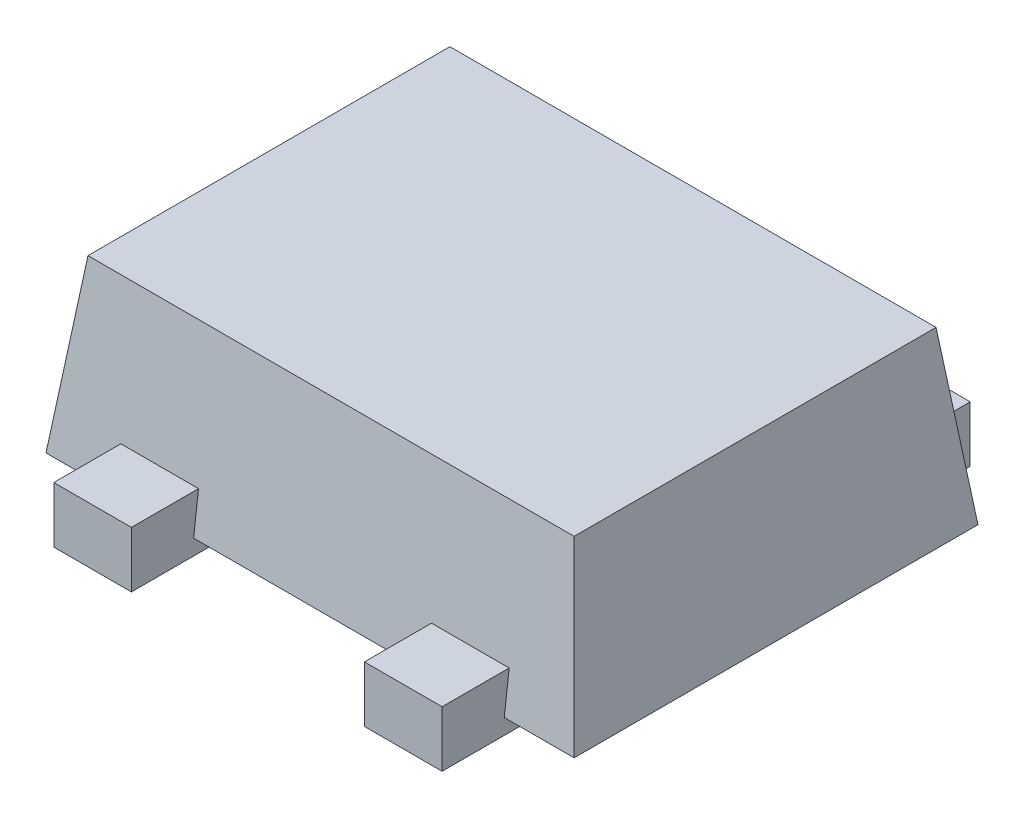
ISO-10303-21;
HEADER;
FILE_DESCRIPTION(('STEP AP214'),'2;1');
FILE_NAME('part.step','',(''),(''),'','','');
FILE_SCHEMA(('AUTOMOTIVE_DESIGN { 1 0 10303 214 1 1 1 1 }'));
ENDSEC;
DATA;
#1=APPLICATION_CONTEXT('core data for automotive mechanical design processes');
#2=APPLICATION_PROTOCOL_DEFINITION('international standard','automotive_design',2000,#1);
#3=PRODUCT_CONTEXT('',#1,'mechanical');
#4=PRODUCT('Part','Part','',(#3));
#5=PRODUCT_RELATED_PRODUCT_CATEGORY('part','',(#4));
#6=PRODUCT_DEFINITION_FORMATION('','',#4);
#7=PRODUCT_DEFINITION_CONTEXT('part definition',#1,'design');
#8=PRODUCT_DEFINITION('design','',#6,#7);
#9=PRODUCT_DEFINITION_SHAPE('','',#8);
#10=(LENGTH_UNIT() NAMED_UNIT(*) SI_UNIT(.MILLI.,.METRE.));
#11=(NAMED_UNIT(*) PLANE_ANGLE_UNIT() SI_UNIT($,.RADIAN.));
#12=(NAMED_UNIT(*) SI_UNIT($,.STERADIAN.) SOLID_ANGLE_UNIT());
#13=UNCERTAINTY_MEASURE_WITH_UNIT(LENGTH_MEASURE(1.E-05),#10,'distance_accuracy_value','');
#14=(GEOMETRIC_REPRESENTATION_CONTEXT(3) GLOBAL_UNCERTAINTY_ASSIGNED_CONTEXT((#13)) GLOBAL_UNIT_ASSIGNED_CONTEXT((#10,
#11,#12)) REPRESENTATION_CONTEXT('',''));
#15=CARTESIAN_POINT('',(0.,0.,0.));
#16=DIRECTION('',(0.,0.,1.));
#17=DIRECTION('',(1.,0.,0.));
#18=AXIS2_PLACEMENT_3D('',#15,#16,#17);
#19=CARTESIAN_POINT('',(-0.375,0.13,0.45));
#20=DIRECTION('',(1.,0.,0.));
#21=DIRECTION('',(0.,0.,-1.));
#22=AXIS2_PLACEMENT_3D('',#19,#20,#21);
#23=PLANE('',#22);
#24=DIRECTION('',(0.,1.,0.));
#25=VECTOR('',#24,1.);
#26=CARTESIAN_POINT('',(-0.375,0.13,0.85));
#27=LINE('',#26,#25);
#28=CARTESIAN_POINT('',(-0.375,-0.0500000000000001,0.85));
#29=VERTEX_POINT('',#28);
#30=CARTESIAN_POINT('',(-0.375,0.13,0.85));
#31=VERTEX_POINT('',#30);
#32=EDGE_CURVE('E107',#29,#31,#27,.T.);
#33=ORIENTED_EDGE('',*,*,#32,.F.);
#34=DIRECTION('',(0.,0.,1.));
#35=VECTOR('',#34,1.);
#36=CARTESIAN_POINT('',(-0.375,-0.0500000000000001,0.45));
#37=LINE('',#36,#35);
#38=CARTESIAN_POINT('',(-0.375,-0.0500000000000001,0.45));
#39=VERTEX_POINT('',#38);
#40=EDGE_CURVE('E12',#39,#29,#37,.T.);
#41=ORIENTED_EDGE('',*,*,#40,.F.);
#42=DIRECTION('',(0.,1.,0.));
#43=VECTOR('',#42,1.);
#44=CARTESIAN_POINT('',(-0.375,0.13,0.45));
#45=LINE('',#44,#43);
#46=CARTESIAN_POINT('',(-0.375,0.13,0.45));
#47=VERTEX_POINT('',#46);
#48=EDGE_CURVE('E101',#39,#47,#45,.T.);
#49=ORIENTED_EDGE('',*,*,#48,.T.);
#50=DIRECTION('',(0.,0.,1.));
#51=VECTOR('',#50,1.);
#52=CARTESIAN_POINT('',(-0.375,0.13,0.45));
#53=LINE('',#52,#51);
#54=EDGE_CURVE('E46',#47,#31,#53,.T.);
#55=ORIENTED_EDGE('',*,*,#54,.T.);
#56=EDGE_LOOP('',(#33,#41,#49,#55));
#57=FACE_BOUND('',#56,.T.);
#58=ADVANCED_FACE('F43',(#57),#23,.T.);
#59=CARTESIAN_POINT('',(-0.625,-0.0500000000000001,0.45));
#60=DIRECTION('',(0.,-1.,0.));
#61=DIRECTION('',(0.,0.,-1.));
#62=AXIS2_PLACEMENT_3D('',#59,#60,#61);
#63=PLANE('',#62);
#64=DIRECTION('',(1.,0.,0.));
#65=VECTOR('',#64,1.);
#66=CARTESIAN_POINT('',(-0.625,-0.0500000000000001,0.85));
#67=LINE('',#66,#65);
#68=CARTESIAN_POINT('',(-0.625,-0.0500000000000001,0.85));
#69=VERTEX_POINT('',#68);
#70=EDGE_CURVE('E103',#69,#29,#67,.T.);
#71=ORIENTED_EDGE('',*,*,#70,.F.);
#72=DIRECTION('',(0.,0.,1.));
#73=VECTOR('',#72,1.);
#74=CARTESIAN_POINT('',(-0.625,-0.0500000000000001,0.45));
#75=LINE('',#74,#73);
#76=CARTESIAN_POINT('',(-0.625,-0.0500000000000001,0.45));
#77=VERTEX_POINT('',#76);
#78=EDGE_CURVE('E52',#77,#69,#75,.T.);
#79=ORIENTED_EDGE('',*,*,#78,.F.);
#80=DIRECTION('',(1.,0.,0.));
#81=VECTOR('',#80,1.);
#82=CARTESIAN_POINT('',(-0.625,-0.0500000000000001,0.45));
#83=LINE('',#82,#81);
#84=EDGE_CURVE('E98',#77,#39,#83,.T.);
#85=ORIENTED_EDGE('',*,*,#84,.T.);
#86=ORIENTED_EDGE('',*,*,#40,.T.);
#87=EDGE_LOOP('',(#71,#79,#85,#86));
#88=FACE_BOUND('',#87,.T.);
#89=ADVANCED_FACE('F117',(#88),#63,.T.);
#90=CARTESIAN_POINT('',(-0.625,0.13,0.45));
#91=DIRECTION('',(-1.,0.,0.));
#92=DIRECTION('',(0.,0.,1.));
#93=AXIS2_PLACEMENT_3D('',#90,#91,#92);
#94=PLANE('',#93);
#95=DIRECTION('',(0.,-1.,0.));
#96=VECTOR('',#95,1.);
#97=CARTESIAN_POINT('',(-0.625,0.13,0.85));
#98=LINE('',#97,#96);
#99=CARTESIAN_POINT('',(-0.625,0.13,0.85));
#100=VERTEX_POINT('',#99);
#101=EDGE_CURVE('E93',#100,#69,#98,.T.);
#102=ORIENTED_EDGE('',*,*,#101,.F.);
#103=DIRECTION('',(0.,0.,1.));
#104=VECTOR('',#103,1.);
#105=CARTESIAN_POINT('',(-0.625,0.13,0.45));
#106=LINE('',#105,#104);
#107=CARTESIAN_POINT('',(-0.625,0.13,0.45));
#108=VERTEX_POINT('',#107);
#109=EDGE_CURVE('E88',#108,#100,#106,.T.);
#110=ORIENTED_EDGE('',*,*,#109,.F.);
#111=DIRECTION('',(0.,-1.,0.));
#112=VECTOR('',#111,1.);
#113=CARTESIAN_POINT('',(-0.625,0.13,0.45));
#114=LINE('',#113,#112);
#115=EDGE_CURVE('E91',#108,#77,#114,.T.);
#116=ORIENTED_EDGE('',*,*,#115,.T.);
#117=ORIENTED_EDGE('',*,*,#78,.T.);
#118=EDGE_LOOP('',(#102,#110,#116,#117));
#119=FACE_BOUND('',#118,.T.);
#120=ADVANCED_FACE('F90',(#119),#94,.T.);
#121=CARTESIAN_POINT('',(-0.625,0.13,0.45));
#122=DIRECTION('',(0.,1.,0.));
#123=DIRECTION('',(0.,0.,1.));
#124=AXIS2_PLACEMENT_3D('',#121,#122,#123);
#125=PLANE('',#124);
#126=DIRECTION('',(-1.,0.,0.));
#127=VECTOR('',#126,1.);
#128=CARTESIAN_POINT('',(-0.625,0.13,0.85));
#129=LINE('',#128,#127);
#130=EDGE_CURVE('E110',#31,#100,#129,.T.);
#131=ORIENTED_EDGE('',*,*,#130,.F.);
#132=ORIENTED_EDGE('',*,*,#54,.F.);
#133=DIRECTION('',(-1.,0.,0.));
#134=VECTOR('',#133,1.);
#135=CARTESIAN_POINT('',(-0.625,0.13,0.45));
#136=LINE('',#135,#134);
#137=EDGE_CURVE('E97',#47,#108,#136,.T.);
#138=ORIENTED_EDGE('',*,*,#137,.T.);
#139=ORIENTED_EDGE('',*,*,#109,.T.);
#140=EDGE_LOOP('',(#131,#132,#138,#139));
#141=FACE_BOUND('',#140,.T.);
#142=ADVANCED_FACE('F100',(#141),#125,.T.);
#143=CARTESIAN_POINT('',(-1.,0.,0.45));
#144=DIRECTION('',(0.,0.,1.));
#145=DIRECTION('',(1.,0.,0.));
#146=AXIS2_PLACEMENT_3D('',#143,#144,#145);
#147=PLANE('',#146);
#148=ORIENTED_EDGE('',*,*,#48,.F.);
#149=ORIENTED_EDGE('',*,*,#84,.F.);
#150=ORIENTED_EDGE('',*,*,#115,.F.);
#151=ORIENTED_EDGE('',*,*,#137,.F.);
#152=EDGE_LOOP('',(#148,#149,#150,#151));
#153=FACE_BOUND('',#152,.T.);
#154=ADVANCED_FACE('F96',(#153),#147,.F.);
#155=CARTESIAN_POINT('',(-1.,0.,0.85));
#156=DIRECTION('',(0.,0.,1.));
#157=DIRECTION('',(1.,0.,0.));
#158=AXIS2_PLACEMENT_3D('',#155,#156,#157);
#159=PLANE('',#158);
#160=ORIENTED_EDGE('',*,*,#32,.T.);
#161=ORIENTED_EDGE('',*,*,#130,.T.);
#162=ORIENTED_EDGE('',*,*,#101,.T.);
#163=ORIENTED_EDGE('',*,*,#70,.T.);
#164=EDGE_LOOP('',(#160,#161,#162,#163));
#165=FACE_BOUND('',#164,.T.);
#166=ADVANCED_FACE('F116',(#165),#159,.T.);
#167=CLOSED_SHELL('',(#58,#89,#120,#142,#154,#166));
#168=MANIFOLD_SOLID_BREP('B2',#167);
#169=CARTESIAN_POINT('',(0.625,0.13,0.45));
#170=DIRECTION('',(1.,0.,0.));
#171=DIRECTION('',(0.,0.,-1.));
#172=AXIS2_PLACEMENT_3D('',#169,#170,#171);
#173=PLANE('',#172);
#174=DIRECTION('',(0.,1.,0.));
#175=VECTOR('',#174,1.);
#176=CARTESIAN_POINT('',(0.625,0.13,0.85));
#177=LINE('',#176,#175);
#178=CARTESIAN_POINT('',(0.625,-0.0500000000000001,0.85));
#179=VERTEX_POINT('',#178);
#180=CARTESIAN_POINT('',(0.625,0.13,0.85));
#181=VERTEX_POINT('',#180);
#182=EDGE_CURVE('E240',#179,#181,#177,.T.);
#183=ORIENTED_EDGE('',*,*,#182,.F.);
#184=DIRECTION('',(0.,0.,1.));
#185=VECTOR('',#184,1.);
#186=CARTESIAN_POINT('',(0.625,-0.0500000000000001,0.45));
#187=LINE('',#186,#185);
#188=CARTESIAN_POINT('',(0.625,-0.0500000000000001,0.45));
#189=VERTEX_POINT('',#188);
#190=EDGE_CURVE('E41',#189,#179,#187,.T.);
#191=ORIENTED_EDGE('',*,*,#190,.F.);
#192=DIRECTION('',(0.,1.,0.));
#193=VECTOR('',#192,1.);
#194=CARTESIAN_POINT('',(0.625,0.13,0.45));
#195=LINE('',#194,#193);
#196=CARTESIAN_POINT('',(0.625,0.13,0.45));
#197=VERTEX_POINT('',#196);
#198=EDGE_CURVE('E234',#189,#197,#195,.T.);
#199=ORIENTED_EDGE('',*,*,#198,.T.);
#200=DIRECTION('',(0.,0.,1.));
#201=VECTOR('',#200,1.);
#202=CARTESIAN_POINT('',(0.625,0.13,0.45));
#203=LINE('',#202,#201);
#204=EDGE_CURVE('E179',#197,#181,#203,.T.);
#205=ORIENTED_EDGE('',*,*,#204,.T.);
#206=EDGE_LOOP('',(#183,#191,#199,#205));
#207=FACE_BOUND('',#206,.T.);
#208=ADVANCED_FACE('F176',(#207),#173,.T.);
#209=CARTESIAN_POINT('',(0.375,-0.0500000000000001,0.45));
#210=DIRECTION('',(0.,-1.,0.));
#211=DIRECTION('',(0.,0.,-1.));
#212=AXIS2_PLACEMENT_3D('',#209,#210,#211);
#213=PLANE('',#212);
#214=DIRECTION('',(1.,0.,0.));
#215=VECTOR('',#214,1.);
#216=CARTESIAN_POINT('',(0.375,-0.0500000000000001,0.85));
#217=LINE('',#216,#215);
#218=CARTESIAN_POINT('',(0.375,-0.0500000000000001,0.85));
#219=VERTEX_POINT('',#218);
#220=EDGE_CURVE('E236',#219,#179,#217,.T.);
#221=ORIENTED_EDGE('',*,*,#220,.F.);
#222=DIRECTION('',(0.,0.,1.));
#223=VECTOR('',#222,1.);
#224=CARTESIAN_POINT('',(0.375,-0.0500000000000001,0.45));
#225=LINE('',#224,#223);
#226=CARTESIAN_POINT('',(0.375,-0.0500000000000001,0.45));
#227=VERTEX_POINT('',#226);
#228=EDGE_CURVE('E185',#227,#219,#225,.T.);
#229=ORIENTED_EDGE('',*,*,#228,.F.);
#230=DIRECTION('',(1.,0.,0.));
#231=VECTOR('',#230,1.);
#232=CARTESIAN_POINT('',(0.375,-0.0500000000000001,0.45));
#233=LINE('',#232,#231);
#234=EDGE_CURVE('E231',#227,#189,#233,.T.);
#235=ORIENTED_EDGE('',*,*,#234,.T.);
#236=ORIENTED_EDGE('',*,*,#190,.T.);
#237=EDGE_LOOP('',(#221,#229,#235,#236));
#238=FACE_BOUND('',#237,.T.);
#239=ADVANCED_FACE('F250',(#238),#213,.T.);
#240=CARTESIAN_POINT('',(0.375,0.13,0.45));
#241=DIRECTION('',(-1.,0.,0.));
#242=DIRECTION('',(0.,0.,1.));
#243=AXIS2_PLACEMENT_3D('',#240,#241,#242);
#244=PLANE('',#243);
#245=DIRECTION('',(0.,-1.,0.));
#246=VECTOR('',#245,1.);
#247=CARTESIAN_POINT('',(0.375,0.13,0.85));
#248=LINE('',#247,#246);
#249=CARTESIAN_POINT('',(0.375,0.13,0.85));
#250=VERTEX_POINT('',#249);
#251=EDGE_CURVE('E226',#250,#219,#248,.T.);
#252=ORIENTED_EDGE('',*,*,#251,.F.);
#253=DIRECTION('',(0.,0.,1.));
#254=VECTOR('',#253,1.);
#255=CARTESIAN_POINT('',(0.375,0.13,0.45));
#256=LINE('',#255,#254);
#257=CARTESIAN_POINT('',(0.375,0.13,0.45));
#258=VERTEX_POINT('',#257);
#259=EDGE_CURVE('E221',#258,#250,#256,.T.);
#260=ORIENTED_EDGE('',*,*,#259,.F.);
#261=DIRECTION('',(0.,-1.,0.));
#262=VECTOR('',#261,1.);
#263=CARTESIAN_POINT('',(0.375,0.13,0.45));
#264=LINE('',#263,#262);
#265=EDGE_CURVE('E224',#258,#227,#264,.T.);
#266=ORIENTED_EDGE('',*,*,#265,.T.);
#267=ORIENTED_EDGE('',*,*,#228,.T.);
#268=EDGE_LOOP('',(#252,#260,#266,#267));
#269=FACE_BOUND('',#268,.T.);
#270=ADVANCED_FACE('F223',(#269),#244,.T.);
#271=CARTESIAN_POINT('',(0.375,0.13,0.45));
#272=DIRECTION('',(0.,1.,0.));
#273=DIRECTION('',(0.,0.,1.));
#274=AXIS2_PLACEMENT_3D('',#271,#272,#273);
#275=PLANE('',#274);
#276=DIRECTION('',(-1.,0.,0.));
#277=VECTOR('',#276,1.);
#278=CARTESIAN_POINT('',(0.375,0.13,0.85));
#279=LINE('',#278,#277);
#280=EDGE_CURVE('E243',#181,#250,#279,.T.);
#281=ORIENTED_EDGE('',*,*,#280,.F.);
#282=ORIENTED_EDGE('',*,*,#204,.F.);
#283=DIRECTION('',(-1.,0.,0.));
#284=VECTOR('',#283,1.);
#285=CARTESIAN_POINT('',(0.375,0.13,0.45));
#286=LINE('',#285,#284);
#287=EDGE_CURVE('E230',#197,#258,#286,.T.);
#288=ORIENTED_EDGE('',*,*,#287,.T.);
#289=ORIENTED_EDGE('',*,*,#259,.T.);
#290=EDGE_LOOP('',(#281,#282,#288,#289));
#291=FACE_BOUND('',#290,.T.);
#292=ADVANCED_FACE('F233',(#291),#275,.T.);
#293=CARTESIAN_POINT('',(0.,0.,0.45));
#294=DIRECTION('',(0.,0.,1.));
#295=DIRECTION('',(1.,0.,0.));
#296=AXIS2_PLACEMENT_3D('',#293,#294,#295);
#297=PLANE('',#296);
#298=ORIENTED_EDGE('',*,*,#198,.F.);
#299=ORIENTED_EDGE('',*,*,#234,.F.);
#300=ORIENTED_EDGE('',*,*,#265,.F.);
#301=ORIENTED_EDGE('',*,*,#287,.F.);
#302=EDGE_LOOP('',(#298,#299,#300,#301));
#303=FACE_BOUND('',#302,.T.);
#304=ADVANCED_FACE('F229',(#303),#297,.F.);
#305=CARTESIAN_POINT('',(0.,0.,0.85));
#306=DIRECTION('',(0.,0.,1.));
#307=DIRECTION('',(1.,0.,0.));
#308=AXIS2_PLACEMENT_3D('',#305,#306,#307);
#309=PLANE('',#308);
#310=ORIENTED_EDGE('',*,*,#182,.T.);
#311=ORIENTED_EDGE('',*,*,#280,.T.);
#312=ORIENTED_EDGE('',*,*,#251,.T.);
#313=ORIENTED_EDGE('',*,*,#220,.T.);
#314=EDGE_LOOP('',(#310,#311,#312,#313));
#315=FACE_BOUND('',#314,.T.);
#316=ADVANCED_FACE('F249',(#315),#309,.T.);
#317=CLOSED_SHELL('',(#208,#239,#270,#292,#304,#316));
#318=MANIFOLD_SOLID_BREP('B6',#317);
#319=CARTESIAN_POINT('',(-0.625,-0.0500000000000001,-0.45));
#320=DIRECTION('',(-1.,0.,0.));
#321=DIRECTION('',(0.,0.,1.));
#322=AXIS2_PLACEMENT_3D('',#319,#320,#321);
#323=PLANE('',#322);
#324=DIRECTION('',(0.,1.,0.));
#325=VECTOR('',#324,1.);
#326=CARTESIAN_POINT('',(-0.625,-0.0500000000000001,-0.85));
#327=LINE('',#326,#325);
#328=CARTESIAN_POINT('',(-0.625,-0.0500000000000001,-0.85));
#329=VERTEX_POINT('',#328);
#330=CARTESIAN_POINT('',(-0.625,0.13,-0.85));
#331=VERTEX_POINT('',#330);
#332=EDGE_CURVE('E373',#329,#331,#327,.T.);
#333=ORIENTED_EDGE('',*,*,#332,.F.);
#334=DIRECTION('',(0.,0.,-1.));
#335=VECTOR('',#334,1.);
#336=CARTESIAN_POINT('',(-0.625,-0.0500000000000001,-0.45));
#337=LINE('',#336,#335);
#338=CARTESIAN_POINT('',(-0.625,-0.0500000000000001,-0.45));
#339=VERTEX_POINT('',#338);
#340=EDGE_CURVE('E174',#339,#329,#337,.T.);
#341=ORIENTED_EDGE('',*,*,#340,.F.);
#342=DIRECTION('',(0.,1.,0.));
#343=VECTOR('',#342,1.);
#344=CARTESIAN_POINT('',(-0.625,-0.0500000000000001,-0.45));
#345=LINE('',#344,#343);
#346=CARTESIAN_POINT('',(-0.625,0.13,-0.45));
#347=VERTEX_POINT('',#346);
#348=EDGE_CURVE('E367',#339,#347,#345,.T.);
#349=ORIENTED_EDGE('',*,*,#348,.T.);
#350=DIRECTION('',(0.,0.,-1.));
#351=VECTOR('',#350,1.);
#352=CARTESIAN_POINT('',(-0.625,0.13,-0.45));
#353=LINE('',#352,#351);
#354=EDGE_CURVE('E312',#347,#331,#353,.T.);
#355=ORIENTED_EDGE('',*,*,#354,.T.);
#356=EDGE_LOOP('',(#333,#341,#349,#355));
#357=FACE_BOUND('',#356,.T.);
#358=ADVANCED_FACE('F309',(#357),#323,.T.);
#359=CARTESIAN_POINT('',(-0.375,-0.0500000000000001,-0.45));
#360=DIRECTION('',(0.,-1.,0.));
#361=DIRECTION('',(0.,0.,-1.));
#362=AXIS2_PLACEMENT_3D('',#359,#360,#361);
#363=PLANE('',#362);
#364=DIRECTION('',(-1.,0.,0.));
#365=VECTOR('',#364,1.);
#366=CARTESIAN_POINT('',(-0.375,-0.0500000000000001,-0.85));
#367=LINE('',#366,#365);
#368=CARTESIAN_POINT('',(-0.375,-0.0500000000000001,-0.85));
#369=VERTEX_POINT('',#368);
#370=EDGE_CURVE('E369',#369,#329,#367,.T.);
#371=ORIENTED_EDGE('',*,*,#370,.F.);
#372=DIRECTION('',(0.,0.,-1.));
#373=VECTOR('',#372,1.);
#374=CARTESIAN_POINT('',(-0.375,-0.0500000000000001,-0.45));
#375=LINE('',#374,#373);
#376=CARTESIAN_POINT('',(-0.375,-0.0500000000000001,-0.45));
#377=VERTEX_POINT('',#376);
#378=EDGE_CURVE('E318',#377,#369,#375,.T.);
#379=ORIENTED_EDGE('',*,*,#378,.F.);
#380=DIRECTION('',(-1.,0.,0.));
#381=VECTOR('',#380,1.);
#382=CARTESIAN_POINT('',(-0.375,-0.0500000000000001,-0.45));
#383=LINE('',#382,#381);
#384=EDGE_CURVE('E364',#377,#339,#383,.T.);
#385=ORIENTED_EDGE('',*,*,#384,.T.);
#386=ORIENTED_EDGE('',*,*,#340,.T.);
#387=EDGE_LOOP('',(#371,#379,#385,#386));
#388=FACE_BOUND('',#387,.T.);
#389=ADVANCED_FACE('F383',(#388),#363,.T.);
#390=CARTESIAN_POINT('',(-0.375,-0.0500000000000001,-0.45));
#391=DIRECTION('',(1.,0.,0.));
#392=DIRECTION('',(0.,0.,-1.));
#393=AXIS2_PLACEMENT_3D('',#390,#391,#392);
#394=PLANE('',#393);
#395=DIRECTION('',(0.,-1.,0.));
#396=VECTOR('',#395,1.);
#397=CARTESIAN_POINT('',(-0.375,-0.0500000000000001,-0.85));
#398=LINE('',#397,#396);
#399=CARTESIAN_POINT('',(-0.375,0.13,-0.85));
#400=VERTEX_POINT('',#399);
#401=EDGE_CURVE('E359',#400,#369,#398,.T.);
#402=ORIENTED_EDGE('',*,*,#401,.F.);
#403=DIRECTION('',(0.,0.,-1.));
#404=VECTOR('',#403,1.);
#405=CARTESIAN_POINT('',(-0.375,0.13,-0.45));
#406=LINE('',#405,#404);
#407=CARTESIAN_POINT('',(-0.375,0.13,-0.45));
#408=VERTEX_POINT('',#407);
#409=EDGE_CURVE('E354',#408,#400,#406,.T.);
#410=ORIENTED_EDGE('',*,*,#409,.F.);
#411=DIRECTION('',(0.,-1.,0.));
#412=VECTOR('',#411,1.);
#413=CARTESIAN_POINT('',(-0.375,-0.0500000000000001,-0.45));
#414=LINE('',#413,#412);
#415=EDGE_CURVE('E357',#408,#377,#414,.T.);
#416=ORIENTED_EDGE('',*,*,#415,.T.);
#417=ORIENTED_EDGE('',*,*,#378,.T.);
#418=EDGE_LOOP('',(#402,#410,#416,#417));
#419=FACE_BOUND('',#418,.T.);
#420=ADVANCED_FACE('F356',(#419),#394,.T.);
#421=CARTESIAN_POINT('',(-0.375,0.13,-0.45));
#422=DIRECTION('',(0.,1.,0.));
#423=DIRECTION('',(0.,0.,1.));
#424=AXIS2_PLACEMENT_3D('',#421,#422,#423);
#425=PLANE('',#424);
#426=DIRECTION('',(1.,0.,0.));
#427=VECTOR('',#426,1.);
#428=CARTESIAN_POINT('',(-0.375,0.13,-0.85));
#429=LINE('',#428,#427);
#430=EDGE_CURVE('E376',#331,#400,#429,.T.);
#431=ORIENTED_EDGE('',*,*,#430,.F.);
#432=ORIENTED_EDGE('',*,*,#354,.F.);
#433=DIRECTION('',(1.,0.,0.));
#434=VECTOR('',#433,1.);
#435=CARTESIAN_POINT('',(-0.375,0.13,-0.45));
#436=LINE('',#435,#434);
#437=EDGE_CURVE('E363',#347,#408,#436,.T.);
#438=ORIENTED_EDGE('',*,*,#437,.T.);
#439=ORIENTED_EDGE('',*,*,#409,.T.);
#440=EDGE_LOOP('',(#431,#432,#438,#439));
#441=FACE_BOUND('',#440,.T.);
#442=ADVANCED_FACE('F366',(#441),#425,.T.);
#443=CARTESIAN_POINT('',(-0.5,0.,-0.45));
#444=DIRECTION('',(0.,0.,1.));
#445=DIRECTION('',(1.,0.,0.));
#446=AXIS2_PLACEMENT_3D('',#443,#444,#445);
#447=PLANE('',#446);
#448=ORIENTED_EDGE('',*,*,#348,.F.);
#449=ORIENTED_EDGE('',*,*,#384,.F.);
#450=ORIENTED_EDGE('',*,*,#415,.F.);
#451=ORIENTED_EDGE('',*,*,#437,.F.);
#452=EDGE_LOOP('',(#448,#449,#450,#451));
#453=FACE_BOUND('',#452,.T.);
#454=ADVANCED_FACE('F362',(#453),#447,.T.);
#455=CARTESIAN_POINT('',(-0.5,0.,-0.85));
#456=DIRECTION('',(0.,0.,1.));
#457=DIRECTION('',(1.,0.,0.));
#458=AXIS2_PLACEMENT_3D('',#455,#456,#457);
#459=PLANE('',#458);
#460=ORIENTED_EDGE('',*,*,#332,.T.);
#461=ORIENTED_EDGE('',*,*,#430,.T.);
#462=ORIENTED_EDGE('',*,*,#401,.T.);
#463=ORIENTED_EDGE('',*,*,#370,.T.);
#464=EDGE_LOOP('',(#460,#461,#462,#463));
#465=FACE_BOUND('',#464,.T.);
#466=ADVANCED_FACE('F382',(#465),#459,.F.);
#467=CLOSED_SHELL('',(#358,#389,#420,#442,#454,#466));
#468=MANIFOLD_SOLID_BREP('B35',#467);
#469=CARTESIAN_POINT('',(0.375,-0.0500000000000001,-0.45));
#470=DIRECTION('',(-1.,0.,0.));
#471=DIRECTION('',(0.,0.,1.));
#472=AXIS2_PLACEMENT_3D('',#469,#470,#471);
#473=PLANE('',#472);
#474=DIRECTION('',(0.,1.,0.));
#475=VECTOR('',#474,1.);
#476=CARTESIAN_POINT('',(0.375,-0.0500000000000001,-0.85));
#477=LINE('',#476,#475);
#478=CARTESIAN_POINT('',(0.375,-0.0500000000000001,-0.85));
#479=VERTEX_POINT('',#478);
#480=CARTESIAN_POINT('',(0.375,0.13,-0.85));
#481=VERTEX_POINT('',#480);
#482=EDGE_CURVE('E506',#479,#481,#477,.T.);
#483=ORIENTED_EDGE('',*,*,#482,.F.);
#484=DIRECTION('',(0.,0.,-1.));
#485=VECTOR('',#484,1.);
#486=CARTESIAN_POINT('',(0.375,-0.0500000000000001,-0.45));
#487=LINE('',#486,#485);
#488=CARTESIAN_POINT('',(0.375,-0.0500000000000001,-0.45));
#489=VERTEX_POINT('',#488);
#490=EDGE_CURVE('E307',#489,#479,#487,.T.);
#491=ORIENTED_EDGE('',*,*,#490,.F.);
#492=DIRECTION('',(0.,1.,0.));
#493=VECTOR('',#492,1.);
#494=CARTESIAN_POINT('',(0.375,-0.0500000000000001,-0.45));
#495=LINE('',#494,#493);
#496=CARTESIAN_POINT('',(0.375,0.13,-0.45));
#497=VERTEX_POINT('',#496);
#498=EDGE_CURVE('E500',#489,#497,#495,.T.);
#499=ORIENTED_EDGE('',*,*,#498,.T.);
#500=DIRECTION('',(0.,0.,-1.));
#501=VECTOR('',#500,1.);
#502=CARTESIAN_POINT('',(0.375,0.13,-0.45));
#503=LINE('',#502,#501);
#504=EDGE_CURVE('E445',#497,#481,#503,.T.);
#505=ORIENTED_EDGE('',*,*,#504,.T.);
#506=EDGE_LOOP('',(#483,#491,#499,#505));
#507=FACE_BOUND('',#506,.T.);
#508=ADVANCED_FACE('F442',(#507),#473,.T.);
#509=CARTESIAN_POINT('',(0.625,-0.0500000000000001,-0.45));
#510=DIRECTION('',(0.,-1.,0.));
#511=DIRECTION('',(0.,0.,-1.));
#512=AXIS2_PLACEMENT_3D('',#509,#510,#511);
#513=PLANE('',#512);
#514=DIRECTION('',(-1.,0.,0.));
#515=VECTOR('',#514,1.);
#516=CARTESIAN_POINT('',(0.625,-0.0500000000000001,-0.85));
#517=LINE('',#516,#515);
#518=CARTESIAN_POINT('',(0.625,-0.0500000000000001,-0.85));
#519=VERTEX_POINT('',#518);
#520=EDGE_CURVE('E502',#519,#479,#517,.T.);
#521=ORIENTED_EDGE('',*,*,#520,.F.);
#522=DIRECTION('',(0.,0.,-1.));
#523=VECTOR('',#522,1.);
#524=CARTESIAN_POINT('',(0.625,-0.0500000000000001,-0.45));
#525=LINE('',#524,#523);
#526=CARTESIAN_POINT('',(0.625,-0.0500000000000001,-0.45));
#527=VERTEX_POINT('',#526);
#528=EDGE_CURVE('E451',#527,#519,#525,.T.);
#529=ORIENTED_EDGE('',*,*,#528,.F.);
#530=DIRECTION('',(-1.,0.,0.));
#531=VECTOR('',#530,1.);
#532=CARTESIAN_POINT('',(0.625,-0.0500000000000001,-0.45));
#533=LINE('',#532,#531);
#534=EDGE_CURVE('E497',#527,#489,#533,.T.);
#535=ORIENTED_EDGE('',*,*,#534,.T.);
#536=ORIENTED_EDGE('',*,*,#490,.T.);
#537=EDGE_LOOP('',(#521,#529,#535,#536));
#538=FACE_BOUND('',#537,.T.);
#539=ADVANCED_FACE('F516',(#538),#513,.T.);
#540=CARTESIAN_POINT('',(0.625,-0.0500000000000001,-0.45));
#541=DIRECTION('',(1.,0.,0.));
#542=DIRECTION('',(0.,0.,-1.));
#543=AXIS2_PLACEMENT_3D('',#540,#541,#542);
#544=PLANE('',#543);
#545=DIRECTION('',(0.,-1.,0.));
#546=VECTOR('',#545,1.);
#547=CARTESIAN_POINT('',(0.625,-0.0500000000000001,-0.85));
#548=LINE('',#547,#546);
#549=CARTESIAN_POINT('',(0.625,0.13,-0.85));
#550=VERTEX_POINT('',#549);
#551=EDGE_CURVE('E492',#550,#519,#548,.T.);
#552=ORIENTED_EDGE('',*,*,#551,.F.);
#553=DIRECTION('',(0.,0.,-1.));
#554=VECTOR('',#553,1.);
#555=CARTESIAN_POINT('',(0.625,0.13,-0.45));
#556=LINE('',#555,#554);
#557=CARTESIAN_POINT('',(0.625,0.13,-0.45));
#558=VERTEX_POINT('',#557);
#559=EDGE_CURVE('E487',#558,#550,#556,.T.);
#560=ORIENTED_EDGE('',*,*,#559,.F.);
#561=DIRECTION('',(0.,-1.,0.));
#562=VECTOR('',#561,1.);
#563=CARTESIAN_POINT('',(0.625,-0.0500000000000001,-0.45));
#564=LINE('',#563,#562);
#565=EDGE_CURVE('E490',#558,#527,#564,.T.);
#566=ORIENTED_EDGE('',*,*,#565,.T.);
#567=ORIENTED_EDGE('',*,*,#528,.T.);
#568=EDGE_LOOP('',(#552,#560,#566,#567));
#569=FACE_BOUND('',#568,.T.);
#570=ADVANCED_FACE('F489',(#569),#544,.T.);
#571=CARTESIAN_POINT('',(0.625,0.13,-0.45));
#572=DIRECTION('',(0.,1.,0.));
#573=DIRECTION('',(0.,0.,1.));
#574=AXIS2_PLACEMENT_3D('',#571,#572,#573);
#575=PLANE('',#574);
#576=DIRECTION('',(1.,0.,0.));
#577=VECTOR('',#576,1.);
#578=CARTESIAN_POINT('',(0.625,0.13,-0.85));
#579=LINE('',#578,#577);
#580=EDGE_CURVE('E509',#481,#550,#579,.T.);
#581=ORIENTED_EDGE('',*,*,#580,.F.);
#582=ORIENTED_EDGE('',*,*,#504,.F.);
#583=DIRECTION('',(1.,0.,0.));
#584=VECTOR('',#583,1.);
#585=CARTESIAN_POINT('',(0.625,0.13,-0.45));
#586=LINE('',#585,#584);
#587=EDGE_CURVE('E496',#497,#558,#586,.T.);
#588=ORIENTED_EDGE('',*,*,#587,.T.);
#589=ORIENTED_EDGE('',*,*,#559,.T.);
#590=EDGE_LOOP('',(#581,#582,#588,#589));
#591=FACE_BOUND('',#590,.T.);
#592=ADVANCED_FACE('F499',(#591),#575,.T.);
#593=CARTESIAN_POINT('',(0.5,0.,-0.45));
#594=DIRECTION('',(0.,0.,1.));
#595=DIRECTION('',(1.,0.,0.));
#596=AXIS2_PLACEMENT_3D('',#593,#594,#595);
#597=PLANE('',#596);
#598=ORIENTED_EDGE('',*,*,#498,.F.);
#599=ORIENTED_EDGE('',*,*,#534,.F.);
#600=ORIENTED_EDGE('',*,*,#565,.F.);
#601=ORIENTED_EDGE('',*,*,#587,.F.);
#602=EDGE_LOOP('',(#598,#599,#600,#601));
#603=FACE_BOUND('',#602,.T.);
#604=ADVANCED_FACE('F495',(#603),#597,.T.);
#605=CARTESIAN_POINT('',(0.5,0.,-0.85));
#606=DIRECTION('',(0.,0.,1.));
#607=DIRECTION('',(1.,0.,0.));
#608=AXIS2_PLACEMENT_3D('',#605,#606,#607);
#609=PLANE('',#608);
#610=ORIENTED_EDGE('',*,*,#482,.T.);
#611=ORIENTED_EDGE('',*,*,#580,.T.);
#612=ORIENTED_EDGE('',*,*,#551,.T.);
#613=ORIENTED_EDGE('',*,*,#520,.T.);
#614=EDGE_LOOP('',(#610,#611,#612,#613));
#615=FACE_BOUND('',#614,.T.);
#616=ADVANCED_FACE('F515',(#615),#609,.F.);
#617=CLOSED_SHELL('',(#508,#539,#570,#592,#604,#616));
#618=MANIFOLD_SOLID_BREP('B168',#617);
#619=CARTESIAN_POINT('',(-0.125,-0.0500000000000001,-0.45));
#620=DIRECTION('',(-1.,0.,0.));
#621=DIRECTION('',(0.,0.,1.));
#622=AXIS2_PLACEMENT_3D('',#619,#620,#621);
#623=PLANE('',#622);
#624=DIRECTION('',(0.,1.,0.));
#625=VECTOR('',#624,1.);
#626=CARTESIAN_POINT('',(-0.125,-0.0500000000000001,-0.85));
#627=LINE('',#626,#625);
#628=CARTESIAN_POINT('',(-0.125,-0.0500000000000001,-0.85));
#629=VERTEX_POINT('',#628);
#630=CARTESIAN_POINT('',(-0.125,0.13,-0.85));
#631=VERTEX_POINT('',#630);
#632=EDGE_CURVE('E638',#629,#631,#627,.T.);
#633=ORIENTED_EDGE('',*,*,#632,.F.);
#634=DIRECTION('',(0.,0.,-1.));
#635=VECTOR('',#634,1.);
#636=CARTESIAN_POINT('',(-0.125,-0.0500000000000001,-0.45));
#637=LINE('',#636,#635);
#638=CARTESIAN_POINT('',(-0.125,-0.0500000000000001,-0.45));
#639=VERTEX_POINT('',#638);
#640=EDGE_CURVE('E440',#639,#629,#637,.T.);
#641=ORIENTED_EDGE('',*,*,#640,.F.);
#642=DIRECTION('',(0.,1.,0.));
#643=VECTOR('',#642,1.);
#644=CARTESIAN_POINT('',(-0.125,-0.0500000000000001,-0.45));
#645=LINE('',#644,#643);
#646=CARTESIAN_POINT('',(-0.125,0.13,-0.45));
#647=VERTEX_POINT('',#646);
#648=EDGE_CURVE('E632',#639,#647,#645,.T.);
#649=ORIENTED_EDGE('',*,*,#648,.T.);
#650=DIRECTION('',(0.,0.,-1.));
#651=VECTOR('',#650,1.);
#652=CARTESIAN_POINT('',(-0.125,0.13,-0.45));
#653=LINE('',#652,#651);
#654=EDGE_CURVE('E577',#647,#631,#653,.T.);
#655=ORIENTED_EDGE('',*,*,#654,.T.);
#656=EDGE_LOOP('',(#633,#641,#649,#655));
#657=FACE_BOUND('',#656,.T.);
#658=ADVANCED_FACE('F574',(#657),#623,.T.);
#659=CARTESIAN_POINT('',(0.125,-0.0500000000000001,-0.45));
#660=DIRECTION('',(0.,-1.,0.));
#661=DIRECTION('',(0.,0.,-1.));
#662=AXIS2_PLACEMENT_3D('',#659,#660,#661);
#663=PLANE('',#662);
#664=DIRECTION('',(-1.,0.,0.));
#665=VECTOR('',#664,1.);
#666=CARTESIAN_POINT('',(0.125,-0.0500000000000001,-0.85));
#667=LINE('',#666,#665);
#668=CARTESIAN_POINT('',(0.125,-0.0500000000000001,-0.85));
#669=VERTEX_POINT('',#668);
#670=EDGE_CURVE('E634',#669,#629,#667,.T.);
#671=ORIENTED_EDGE('',*,*,#670,.F.);
#672=DIRECTION('',(0.,0.,-1.));
#673=VECTOR('',#672,1.);
#674=CARTESIAN_POINT('',(0.125,-0.0500000000000001,-0.45));
#675=LINE('',#674,#673);
#676=CARTESIAN_POINT('',(0.125,-0.0500000000000001,-0.45));
#677=VERTEX_POINT('',#676);
#678=EDGE_CURVE('E583',#677,#669,#675,.T.);
#679=ORIENTED_EDGE('',*,*,#678,.F.);
#680=DIRECTION('',(-1.,0.,0.));
#681=VECTOR('',#680,1.);
#682=CARTESIAN_POINT('',(0.125,-0.0500000000000001,-0.45));
#683=LINE('',#682,#681);
#684=EDGE_CURVE('E629',#677,#639,#683,.T.);
#685=ORIENTED_EDGE('',*,*,#684,.T.);
#686=ORIENTED_EDGE('',*,*,#640,.T.);
#687=EDGE_LOOP('',(#671,#679,#685,#686));
#688=FACE_BOUND('',#687,.T.);
#689=ADVANCED_FACE('F648',(#688),#663,.T.);
#690=CARTESIAN_POINT('',(0.125,-0.0500000000000001,-0.45));
#691=DIRECTION('',(1.,0.,0.));
#692=DIRECTION('',(0.,0.,-1.));
#693=AXIS2_PLACEMENT_3D('',#690,#691,#692);
#694=PLANE('',#693);
#695=DIRECTION('',(0.,-1.,0.));
#696=VECTOR('',#695,1.);
#697=CARTESIAN_POINT('',(0.125,-0.0500000000000001,-0.85));
#698=LINE('',#697,#696);
#699=CARTESIAN_POINT('',(0.125,0.13,-0.85));
#700=VERTEX_POINT('',#699);
#701=EDGE_CURVE('E624',#700,#669,#698,.T.);
#702=ORIENTED_EDGE('',*,*,#701,.F.);
#703=DIRECTION('',(0.,0.,-1.));
#704=VECTOR('',#703,1.);
#705=CARTESIAN_POINT('',(0.125,0.13,-0.45));
#706=LINE('',#705,#704);
#707=CARTESIAN_POINT('',(0.125,0.13,-0.45));
#708=VERTEX_POINT('',#707);
#709=EDGE_CURVE('E619',#708,#700,#706,.T.);
#710=ORIENTED_EDGE('',*,*,#709,.F.);
#711=DIRECTION('',(0.,-1.,0.));
#712=VECTOR('',#711,1.);
#713=CARTESIAN_POINT('',(0.125,-0.0500000000000001,-0.45));
#714=LINE('',#713,#712);
#715=EDGE_CURVE('E622',#708,#677,#714,.T.);
#716=ORIENTED_EDGE('',*,*,#715,.T.);
#717=ORIENTED_EDGE('',*,*,#678,.T.);
#718=EDGE_LOOP('',(#702,#710,#716,#717));
#719=FACE_BOUND('',#718,.T.);
#720=ADVANCED_FACE('F621',(#719),#694,.T.);
#721=CARTESIAN_POINT('',(0.125,0.13,-0.45));
#722=DIRECTION('',(0.,1.,0.));
#723=DIRECTION('',(0.,0.,1.));
#724=AXIS2_PLACEMENT_3D('',#721,#722,#723);
#725=PLANE('',#724);
#726=DIRECTION('',(1.,0.,0.));
#727=VECTOR('',#726,1.);
#728=CARTESIAN_POINT('',(0.125,0.13,-0.85));
#729=LINE('',#728,#727);
#730=EDGE_CURVE('E641',#631,#700,#729,.T.);
#731=ORIENTED_EDGE('',*,*,#730,.F.);
#732=ORIENTED_EDGE('',*,*,#654,.F.);
#733=DIRECTION('',(1.,0.,0.));
#734=VECTOR('',#733,1.);
#735=CARTESIAN_POINT('',(0.125,0.13,-0.45));
#736=LINE('',#735,#734);
#737=EDGE_CURVE('E628',#647,#708,#736,.T.);
#738=ORIENTED_EDGE('',*,*,#737,.T.);
#739=ORIENTED_EDGE('',*,*,#709,.T.);
#740=EDGE_LOOP('',(#731,#732,#738,#739));
#741=FACE_BOUND('',#740,.T.);
#742=ADVANCED_FACE('F631',(#741),#725,.T.);
#743=CARTESIAN_POINT('',(0.,0.,-0.45));
#744=DIRECTION('',(0.,0.,1.));
#745=DIRECTION('',(1.,0.,0.));
#746=AXIS2_PLACEMENT_3D('',#743,#744,#745);
#747=PLANE('',#746);
#748=ORIENTED_EDGE('',*,*,#648,.F.);
#749=ORIENTED_EDGE('',*,*,#684,.F.);
#750=ORIENTED_EDGE('',*,*,#715,.F.);
#751=ORIENTED_EDGE('',*,*,#737,.F.);
#752=EDGE_LOOP('',(#748,#749,#750,#751));
#753=FACE_BOUND('',#752,.T.);
#754=ADVANCED_FACE('F627',(#753),#747,.T.);
#755=CARTESIAN_POINT('',(0.,0.,-0.85));
#756=DIRECTION('',(0.,0.,1.));
#757=DIRECTION('',(1.,0.,0.));
#758=AXIS2_PLACEMENT_3D('',#755,#756,#757);
#759=PLANE('',#758);
#760=ORIENTED_EDGE('',*,*,#632,.T.);
#761=ORIENTED_EDGE('',*,*,#730,.T.);
#762=ORIENTED_EDGE('',*,*,#701,.T.);
#763=ORIENTED_EDGE('',*,*,#670,.T.);
#764=EDGE_LOOP('',(#760,#761,#762,#763));
#765=FACE_BOUND('',#764,.T.);
#766=ADVANCED_FACE('F647',(#765),#759,.F.);
#767=CLOSED_SHELL('',(#658,#689,#720,#742,#754,#766));
#768=MANIFOLD_SOLID_BREP('B301',#767);
#769=CARTESIAN_POINT('',(0.85,0.,0.65));
#770=DIRECTION('',(0.992546151641322,0.121869343405148,0.));
#771=DIRECTION('',(-0.121869343405148,0.992546151641322,0.));
#772=AXIS2_PLACEMENT_3D('',#769,#770,#771);
#773=PLANE('',#772);
#774=DIRECTION('',(0.,0.,-1.));
#775=VECTOR('',#774,1.);
#776=CARTESIAN_POINT('',(0.85,0.,0.65));
#777=LINE('',#776,#775);
#778=CARTESIAN_POINT('',(0.85,0.,0.65));
#779=VERTEX_POINT('',#778);
#780=CARTESIAN_POINT('',(0.85,0.,-0.65));
#781=VERTEX_POINT('',#780);
#782=EDGE_CURVE('E743',#779,#781,#777,.T.);
#783=ORIENTED_EDGE('',*,*,#782,.T.);
#784=DIRECTION('',(0.120974291151355,-0.985256536015293,-0.120974291151355));
#785=VECTOR('',#784,1.);
#786=CARTESIAN_POINT('',(0.825120875496726,0.202624208779372,-0.625120875496726));
#787=LINE('',#786,#785);
#788=CARTESIAN_POINT('',(0.782468491503402,0.55,-0.582468491503402));
#789=VERTEX_POINT('',#788);
#790=EDGE_CURVE('E572',#789,#781,#787,.T.);
#791=ORIENTED_EDGE('',*,*,#790,.F.);
#792=DIRECTION('',(0.,0.,1.));
#793=VECTOR('',#792,1.);
#794=CARTESIAN_POINT('',(0.782468491503402,0.55,0.));
#795=LINE('',#794,#793);
#796=CARTESIAN_POINT('',(0.782468491503402,0.55,0.582468491503402));
#797=VERTEX_POINT('',#796);
#798=EDGE_CURVE('E759',#797,#789,#795,.F.);
#799=ORIENTED_EDGE('',*,*,#798,.F.);
#800=DIRECTION('',(0.120974291151355,-0.985256536015293,0.120974291151355));
#801=VECTOR('',#800,1.);
#802=CARTESIAN_POINT('',(0.85,0.,0.65));
#803=LINE('',#802,#801);
#804=EDGE_CURVE('E754',#797,#779,#803,.T.);
#805=ORIENTED_EDGE('',*,*,#804,.T.);
#806=EDGE_LOOP('',(#783,#791,#799,#805));
#807=FACE_BOUND('',#806,.T.);
#808=ADVANCED_FACE('F697',(#807),#773,.T.);
#809=CARTESIAN_POINT('',(-0.85,0.,-0.65));
#810=DIRECTION('',(0.,0.121869343405148,-0.992546151641322));
#811=DIRECTION('',(0.,0.992546151641322,0.121869343405148));
#812=AXIS2_PLACEMENT_3D('',#809,#810,#811);
#813=PLANE('',#812);
#814=DIRECTION('',(-1.,0.,0.));
#815=VECTOR('',#814,1.);
#816=CARTESIAN_POINT('',(-0.85,0.,-0.65));
#817=LINE('',#816,#815);
#818=CARTESIAN_POINT('',(-0.85,0.,-0.65));
#819=VERTEX_POINT('',#818);
#820=EDGE_CURVE('E739',#781,#819,#817,.T.);
#821=ORIENTED_EDGE('',*,*,#820,.T.);
#822=DIRECTION('',(-0.120974291151355,-0.985256536015293,-0.120974291151355));
#823=VECTOR('',#822,1.);
#824=CARTESIAN_POINT('',(-0.830974787144556,0.154947924360696,-0.630974787144555));
#825=LINE('',#824,#823);
#826=CARTESIAN_POINT('',(-0.782468491503402,0.55,-0.582468491503402));
#827=VERTEX_POINT('',#826);
#828=EDGE_CURVE('E706',#827,#819,#825,.T.);
#829=ORIENTED_EDGE('',*,*,#828,.F.);
#830=DIRECTION('',(1.,0.,0.));
#831=VECTOR('',#830,1.);
#832=CARTESIAN_POINT('',(0.,0.55,-0.582468491503402));
#833=LINE('',#832,#831);
#834=EDGE_CURVE('E750',#789,#827,#833,.F.);
#835=ORIENTED_EDGE('',*,*,#834,.F.);
#836=ORIENTED_EDGE('',*,*,#790,.T.);
#837=EDGE_LOOP('',(#821,#829,#835,#836));
#838=FACE_BOUND('',#837,.T.);
#839=ADVANCED_FACE('F699',(#838),#813,.T.);
#840=CARTESIAN_POINT('',(-0.85,0.,0.65));
#841=DIRECTION('',(-0.992546151641322,0.121869343405148,0.));
#842=DIRECTION('',(-0.121869343405148,-0.992546151641322,0.));
#843=AXIS2_PLACEMENT_3D('',#840,#841,#842);
#844=PLANE('',#843);
#845=DIRECTION('',(0.,0.,1.));
#846=VECTOR('',#845,1.);
#847=CARTESIAN_POINT('',(-0.85,0.,0.65));
#848=LINE('',#847,#846);
#849=CARTESIAN_POINT('',(-0.85,0.,0.65));
#850=VERTEX_POINT('',#849);
#851=EDGE_CURVE('E744',#819,#850,#848,.T.);
#852=ORIENTED_EDGE('',*,*,#851,.T.);
#853=DIRECTION('',(-0.120974291151355,-0.985256536015293,0.120974291151355));
#854=VECTOR('',#853,1.);
#855=CARTESIAN_POINT('',(-0.85,0.,0.65));
#856=LINE('',#855,#854);
#857=CARTESIAN_POINT('',(-0.782468491503402,0.55,0.582468491503402));
#858=VERTEX_POINT('',#857);
#859=EDGE_CURVE('E762',#858,#850,#856,.T.);
#860=ORIENTED_EDGE('',*,*,#859,.F.);
#861=DIRECTION('',(0.,0.,-1.));
#862=VECTOR('',#861,1.);
#863=CARTESIAN_POINT('',(-0.782468491503402,0.55,0.));
#864=LINE('',#863,#862);
#865=EDGE_CURVE('E718',#827,#858,#864,.F.);
#866=ORIENTED_EDGE('',*,*,#865,.F.);
#867=ORIENTED_EDGE('',*,*,#828,.T.);
#868=EDGE_LOOP('',(#852,#860,#866,#867));
#869=FACE_BOUND('',#868,.T.);
#870=ADVANCED_FACE('F769',(#869),#844,.T.);
#871=CARTESIAN_POINT('',(-0.85,0.,0.65));
#872=DIRECTION('',(0.,0.121869343405148,0.992546151641322));
#873=DIRECTION('',(0.,-0.992546151641322,0.121869343405148));
#874=AXIS2_PLACEMENT_3D('',#871,#872,#873);
#875=PLANE('',#874);
#876=DIRECTION('',(1.,0.,0.));
#877=VECTOR('',#876,1.);
#878=CARTESIAN_POINT('',(-0.85,0.,0.65));
#879=LINE('',#878,#877);
#880=EDGE_CURVE('E758',#850,#779,#879,.T.);
#881=ORIENTED_EDGE('',*,*,#880,.T.);
#882=ORIENTED_EDGE('',*,*,#804,.F.);
#883=DIRECTION('',(-1.,0.,0.));
#884=VECTOR('',#883,1.);
#885=CARTESIAN_POINT('',(0.,0.55,0.582468491503403));
#886=LINE('',#885,#884);
#887=EDGE_CURVE('E701',#858,#797,#886,.F.);
#888=ORIENTED_EDGE('',*,*,#887,.F.);
#889=ORIENTED_EDGE('',*,*,#859,.T.);
#890=EDGE_LOOP('',(#881,#882,#888,#889));
#891=FACE_BOUND('',#890,.T.);
#892=ADVANCED_FACE('F771',(#891),#875,.T.);
#893=CARTESIAN_POINT('',(0.,0.55,0.));
#894=DIRECTION('',(0.,-1.,0.));
#895=DIRECTION('',(0.,0.,-1.));
#896=AXIS2_PLACEMENT_3D('',#893,#894,#895);
#897=PLANE('',#896);
#898=ORIENTED_EDGE('',*,*,#798,.T.);
#899=ORIENTED_EDGE('',*,*,#834,.T.);
#900=ORIENTED_EDGE('',*,*,#865,.T.);
#901=ORIENTED_EDGE('',*,*,#887,.T.);
#902=EDGE_LOOP('',(#898,#899,#900,#901));
#903=FACE_BOUND('',#902,.T.);
#904=ADVANCED_FACE('F767',(#903),#897,.F.);
#905=CARTESIAN_POINT('',(0.,0.,0.));
#906=DIRECTION('',(0.,-1.,0.));
#907=DIRECTION('',(0.,0.,-1.));
#908=AXIS2_PLACEMENT_3D('',#905,#906,#907);
#909=PLANE('',#908);
#910=ORIENTED_EDGE('',*,*,#782,.F.);
#911=ORIENTED_EDGE('',*,*,#880,.F.);
#912=ORIENTED_EDGE('',*,*,#851,.F.);
#913=ORIENTED_EDGE('',*,*,#820,.F.);
#914=EDGE_LOOP('',(#910,#911,#912,#913));
#915=FACE_BOUND('',#914,.T.);
#916=ADVANCED_FACE('F740',(#915),#909,.T.);
#917=CLOSED_SHELL('',(#808,#839,#870,#892,#904,#916));
#918=MANIFOLD_SOLID_BREP('B434',#917);
#919=ADVANCED_BREP_SHAPE_REPRESENTATION('',(#18,#168,#318,#468,#618,#768,#918),#14);
#920=SHAPE_DEFINITION_REPRESENTATION(#9,#919);
ENDSEC;
END-ISO-10303-21;
